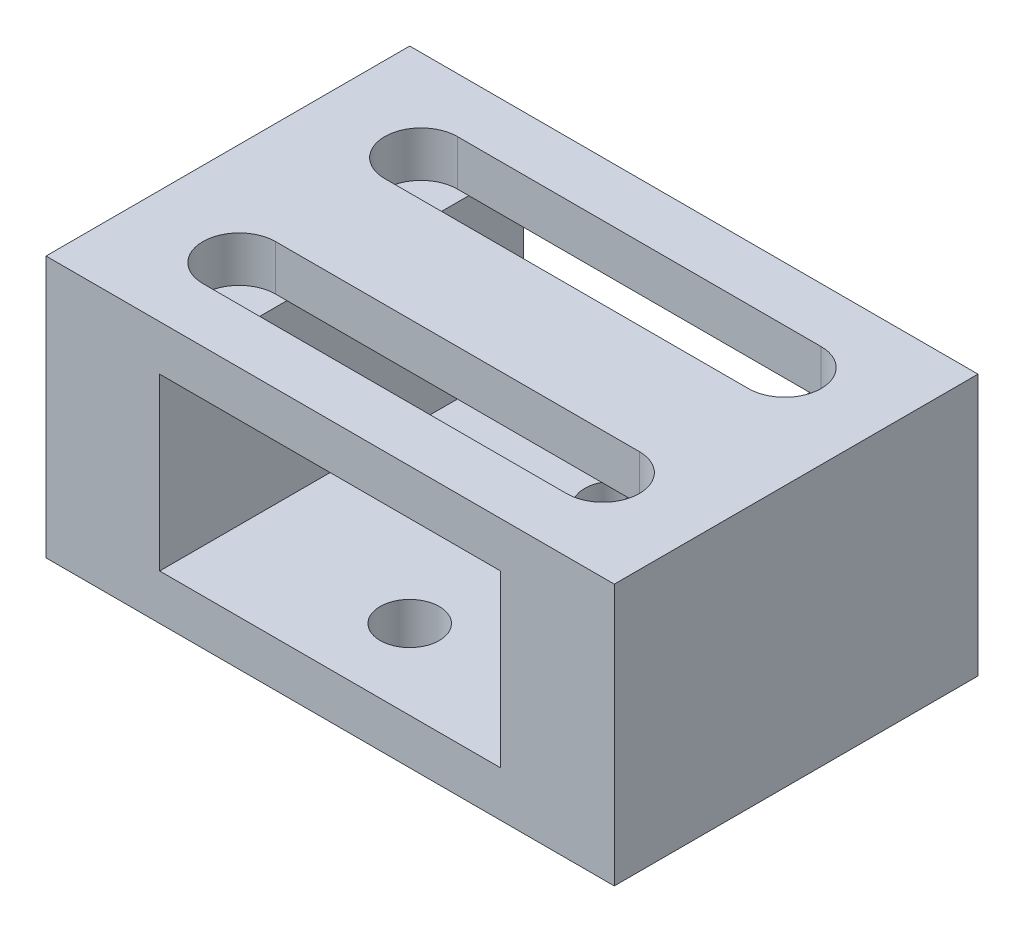
ISO-10303-21;
HEADER;
FILE_DESCRIPTION(('STEP AP214'),'2;1');
FILE_NAME('part.step','',(''),(''),'','','');
FILE_SCHEMA(('AUTOMOTIVE_DESIGN { 1 0 10303 214 1 1 1 1 }'));
ENDSEC;
DATA;
#1=APPLICATION_CONTEXT('core data for automotive mechanical design processes');
#2=APPLICATION_PROTOCOL_DEFINITION('international standard','automotive_design',2000,#1);
#3=PRODUCT_CONTEXT('',#1,'mechanical');
#4=PRODUCT('Part','Part','',(#3));
#5=PRODUCT_RELATED_PRODUCT_CATEGORY('part','',(#4));
#6=PRODUCT_DEFINITION_FORMATION('','',#4);
#7=PRODUCT_DEFINITION_CONTEXT('part definition',#1,'design');
#8=PRODUCT_DEFINITION('design','',#6,#7);
#9=PRODUCT_DEFINITION_SHAPE('','',#8);
#10=(LENGTH_UNIT() NAMED_UNIT(*) SI_UNIT(.MILLI.,.METRE.));
#11=(NAMED_UNIT(*) PLANE_ANGLE_UNIT() SI_UNIT($,.RADIAN.));
#12=(NAMED_UNIT(*) SI_UNIT($,.STERADIAN.) SOLID_ANGLE_UNIT());
#13=UNCERTAINTY_MEASURE_WITH_UNIT(LENGTH_MEASURE(1.E-05),#10,'distance_accuracy_value','');
#14=(GEOMETRIC_REPRESENTATION_CONTEXT(3) GLOBAL_UNCERTAINTY_ASSIGNED_CONTEXT((#13)) GLOBAL_UNIT_ASSIGNED_CONTEXT((#10,
#11,#12)) REPRESENTATION_CONTEXT('',''));
#15=CARTESIAN_POINT('',(0.,0.,0.));
#16=DIRECTION('',(0.,0.,1.));
#17=DIRECTION('',(1.,0.,0.));
#18=AXIS2_PLACEMENT_3D('',#15,#16,#17);
#19=CARTESIAN_POINT('',(-25.,28.,-36.25));
#20=DIRECTION('',(0.,1.,0.));
#21=DIRECTION('',(0.,0.,1.));
#22=AXIS2_PLACEMENT_3D('',#19,#20,#21);
#23=PLANE('',#22);
#24=DIRECTION('',(1.,0.,0.));
#25=VECTOR('',#24,1.);
#26=CARTESIAN_POINT('',(-16.,28.,-57.05));
#27=LINE('',#26,#25);
#28=CARTESIAN_POINT('',(-16.,28.,-57.05));
#29=VERTEX_POINT('',#28);
#30=CARTESIAN_POINT('',(16.,28.,-57.05));
#31=VERTEX_POINT('',#30);
#32=EDGE_CURVE('E170',#29,#31,#27,.T.);
#33=ORIENTED_EDGE('',*,*,#32,.F.);
#34=CARTESIAN_POINT('',(-16.,28.,-60.25));
#35=DIRECTION('',(0.,1.,0.));
#36=DIRECTION('',(0.,0.,1.));
#37=AXIS2_PLACEMENT_3D('',#34,#35,#36);
#38=CIRCLE('',#37,3.19999999999999);
#39=CARTESIAN_POINT('',(-16.,28.,-63.45));
#40=VERTEX_POINT('',#39);
#41=EDGE_CURVE('E172',#40,#29,#38,.T.);
#42=ORIENTED_EDGE('',*,*,#41,.F.);
#43=DIRECTION('',(-1.,0.,0.));
#44=VECTOR('',#43,1.);
#45=CARTESIAN_POINT('',(-16.,28.,-63.45));
#46=LINE('',#45,#44);
#47=CARTESIAN_POINT('',(16.,28.,-63.45));
#48=VERTEX_POINT('',#47);
#49=EDGE_CURVE('E161',#48,#40,#46,.T.);
#50=ORIENTED_EDGE('',*,*,#49,.F.);
#51=CARTESIAN_POINT('',(16.,28.,-60.25));
#52=DIRECTION('',(0.,1.,0.));
#53=DIRECTION('',(0.,0.,1.));
#54=AXIS2_PLACEMENT_3D('',#51,#52,#53);
#55=CIRCLE('',#54,3.19999999999998);
#56=EDGE_CURVE('E168',#31,#48,#55,.T.);
#57=ORIENTED_EDGE('',*,*,#56,.F.);
#58=EDGE_LOOP('',(#33,#42,#50,#57));
#59=FACE_BOUND('',#58,.T.);
#60=DIRECTION('',(1.,0.,0.));
#61=VECTOR('',#60,1.);
#62=CARTESIAN_POINT('',(-16.,28.,-41.05));
#63=LINE('',#62,#61);
#64=CARTESIAN_POINT('',(-16.,28.,-41.05));
#65=VERTEX_POINT('',#64);
#66=CARTESIAN_POINT('',(16.,28.,-41.05));
#67=VERTEX_POINT('',#66);
#68=EDGE_CURVE('E243',#65,#67,#63,.T.);
#69=ORIENTED_EDGE('',*,*,#68,.F.);
#70=CARTESIAN_POINT('',(-16.,28.,-44.25));
#71=DIRECTION('',(0.,1.,0.));
#72=DIRECTION('',(0.,0.,1.));
#73=AXIS2_PLACEMENT_3D('',#70,#71,#72);
#74=CIRCLE('',#73,3.2);
#75=CARTESIAN_POINT('',(-16.,28.,-47.45));
#76=VERTEX_POINT('',#75);
#77=EDGE_CURVE('E142',#76,#65,#74,.T.);
#78=ORIENTED_EDGE('',*,*,#77,.F.);
#79=DIRECTION('',(-1.,0.,0.));
#80=VECTOR('',#79,1.);
#81=CARTESIAN_POINT('',(-16.,28.,-47.45));
#82=LINE('',#81,#80);
#83=CARTESIAN_POINT('',(16.,28.,-47.45));
#84=VERTEX_POINT('',#83);
#85=EDGE_CURVE('E143',#84,#76,#82,.T.);
#86=ORIENTED_EDGE('',*,*,#85,.F.);
#87=CARTESIAN_POINT('',(16.,28.,-44.25));
#88=DIRECTION('',(0.,1.,0.));
#89=DIRECTION('',(0.,0.,1.));
#90=AXIS2_PLACEMENT_3D('',#87,#88,#89);
#91=CIRCLE('',#90,3.2);
#92=EDGE_CURVE('E148',#67,#84,#91,.T.);
#93=ORIENTED_EDGE('',*,*,#92,.F.);
#94=EDGE_LOOP('',(#69,#78,#86,#93));
#95=FACE_BOUND('',#94,.T.);
#96=DIRECTION('',(0.,0.,1.));
#97=VECTOR('',#96,1.);
#98=CARTESIAN_POINT('',(-25.,28.,0.));
#99=LINE('',#98,#97);
#100=CARTESIAN_POINT('',(-25.,28.,-68.25));
#101=VERTEX_POINT('',#100);
#102=CARTESIAN_POINT('',(-25.,28.,-36.25));
#103=VERTEX_POINT('',#102);
#104=EDGE_CURVE('E391',#101,#103,#99,.T.);
#105=ORIENTED_EDGE('',*,*,#104,.T.);
#106=DIRECTION('',(-1.,0.,0.));
#107=VECTOR('',#106,1.);
#108=CARTESIAN_POINT('',(25.,28.,-36.25));
#109=LINE('',#108,#107);
#110=CARTESIAN_POINT('',(25.,28.,-36.25));
#111=VERTEX_POINT('',#110);
#112=EDGE_CURVE('E397',#111,#103,#109,.T.);
#113=ORIENTED_EDGE('',*,*,#112,.F.);
#114=DIRECTION('',(0.,0.,1.));
#115=VECTOR('',#114,1.);
#116=CARTESIAN_POINT('',(25.,28.,0.));
#117=LINE('',#116,#115);
#118=CARTESIAN_POINT('',(25.,28.,-68.25));
#119=VERTEX_POINT('',#118);
#120=EDGE_CURVE('E396',#119,#111,#117,.T.);
#121=ORIENTED_EDGE('',*,*,#120,.F.);
#122=DIRECTION('',(-1.,0.,0.));
#123=VECTOR('',#122,1.);
#124=CARTESIAN_POINT('',(25.,28.,-68.25));
#125=LINE('',#124,#123);
#126=EDGE_CURVE('E407',#119,#101,#125,.T.);
#127=ORIENTED_EDGE('',*,*,#126,.T.);
#128=EDGE_LOOP('',(#105,#113,#121,#127));
#129=FACE_BOUND('',#128,.T.);
#130=ADVANCED_FACE('F40',(#59,#95,#129),#23,.T.);
#131=CARTESIAN_POINT('',(15.,9.00000000000002,110.001));
#132=DIRECTION('',(1.,0.,0.));
#133=DIRECTION('',(0.,0.,-1.));
#134=AXIS2_PLACEMENT_3D('',#131,#132,#133);
#135=PLANE('',#134);
#136=DIRECTION('',(0.,1.,0.));
#137=VECTOR('',#136,1.);
#138=CARTESIAN_POINT('',(15.,9.00000000000002,-36.25));
#139=LINE('',#138,#137);
#140=CARTESIAN_POINT('',(15.,9.00000000000002,-36.25));
#141=VERTEX_POINT('',#140);
#142=CARTESIAN_POINT('',(15.,24.,-36.25));
#143=VERTEX_POINT('',#142);
#144=EDGE_CURVE('E156',#141,#143,#139,.T.);
#145=ORIENTED_EDGE('',*,*,#144,.T.);
#146=DIRECTION('',(0.,0.,-1.));
#147=VECTOR('',#146,1.);
#148=CARTESIAN_POINT('',(15.,24.,110.001));
#149=LINE('',#148,#147);
#150=CARTESIAN_POINT('',(15.,24.,-41.05));
#151=VERTEX_POINT('',#150);
#152=EDGE_CURVE('E267',#143,#151,#149,.T.);
#153=ORIENTED_EDGE('',*,*,#152,.T.);
#154=CARTESIAN_POINT('',(15.,24.,-47.45));
#155=VERTEX_POINT('',#154);
#156=EDGE_CURVE('E261',#151,#155,#149,.T.);
#157=ORIENTED_EDGE('',*,*,#156,.T.);
#158=CARTESIAN_POINT('',(15.,24.,-57.05));
#159=VERTEX_POINT('',#158);
#160=EDGE_CURVE('E266',#155,#159,#149,.T.);
#161=ORIENTED_EDGE('',*,*,#160,.T.);
#162=CARTESIAN_POINT('',(15.,24.,-63.45));
#163=VERTEX_POINT('',#162);
#164=EDGE_CURVE('E279',#159,#163,#149,.T.);
#165=ORIENTED_EDGE('',*,*,#164,.T.);
#166=CARTESIAN_POINT('',(15.,24.,-68.25));
#167=VERTEX_POINT('',#166);
#168=EDGE_CURVE('E275',#163,#167,#149,.T.);
#169=ORIENTED_EDGE('',*,*,#168,.T.);
#170=DIRECTION('',(0.,-1.,0.));
#171=VECTOR('',#170,1.);
#172=CARTESIAN_POINT('',(15.,9.00000000000002,-68.25));
#173=LINE('',#172,#171);
#174=CARTESIAN_POINT('',(15.,9.00000000000002,-68.25));
#175=VERTEX_POINT('',#174);
#176=EDGE_CURVE('E372',#167,#175,#173,.T.);
#177=ORIENTED_EDGE('',*,*,#176,.T.);
#178=DIRECTION('',(0.,0.,-1.));
#179=VECTOR('',#178,1.);
#180=CARTESIAN_POINT('',(15.,9.00000000000002,110.001));
#181=LINE('',#180,#179);
#182=EDGE_CURVE('E213',#141,#175,#181,.T.);
#183=ORIENTED_EDGE('',*,*,#182,.F.);
#184=EDGE_LOOP('',(#145,#153,#157,#161,#165,#169,#177,#183));
#185=FACE_BOUND('',#184,.T.);
#186=ADVANCED_FACE('F274',(#185),#135,.F.);
#187=CARTESIAN_POINT('',(15.,24.,110.001));
#188=DIRECTION('',(0.,1.,0.));
#189=DIRECTION('',(0.,0.,1.));
#190=AXIS2_PLACEMENT_3D('',#187,#188,#189);
#191=PLANE('',#190);
#192=ORIENTED_EDGE('',*,*,#168,.F.);
#193=DIRECTION('',(1.,0.,0.));
#194=VECTOR('',#193,1.);
#195=CARTESIAN_POINT('',(-16.,24.,-63.45));
#196=LINE('',#195,#194);
#197=CARTESIAN_POINT('',(-15.,24.,-63.45));
#198=VERTEX_POINT('',#197);
#199=EDGE_CURVE('E180',#198,#163,#196,.T.);
#200=ORIENTED_EDGE('',*,*,#199,.F.);
#201=DIRECTION('',(0.,0.,-1.));
#202=VECTOR('',#201,1.);
#203=CARTESIAN_POINT('',(-15.,24.,110.001));
#204=LINE('',#203,#202);
#205=CARTESIAN_POINT('',(-15.,24.,-68.25));
#206=VERTEX_POINT('',#205);
#207=EDGE_CURVE('E285',#198,#206,#204,.T.);
#208=ORIENTED_EDGE('',*,*,#207,.T.);
#209=DIRECTION('',(1.,0.,0.));
#210=VECTOR('',#209,1.);
#211=CARTESIAN_POINT('',(15.,24.,-68.25));
#212=LINE('',#211,#210);
#213=EDGE_CURVE('E366',#206,#167,#212,.T.);
#214=ORIENTED_EDGE('',*,*,#213,.T.);
#215=EDGE_LOOP('',(#192,#200,#208,#214));
#216=FACE_BOUND('',#215,.T.);
#217=ADVANCED_FACE('F364',(#216),#191,.F.);
#218=CARTESIAN_POINT('',(-16.,-14.9296801939086,-63.45));
#219=DIRECTION('',(0.,0.,-1.));
#220=DIRECTION('',(-1.,0.,0.));
#221=AXIS2_PLACEMENT_3D('',#218,#219,#220);
#222=PLANE('',#221);
#223=CARTESIAN_POINT('',(-16.,24.,-63.45));
#224=VERTEX_POINT('',#223);
#225=EDGE_CURVE('E177',#224,#198,#196,.T.);
#226=ORIENTED_EDGE('',*,*,#225,.T.);
#227=ORIENTED_EDGE('',*,*,#199,.T.);
#228=CARTESIAN_POINT('',(16.,24.,-63.45));
#229=VERTEX_POINT('',#228);
#230=EDGE_CURVE('E181',#163,#229,#196,.T.);
#231=ORIENTED_EDGE('',*,*,#230,.T.);
#232=DIRECTION('',(0.,1.,0.));
#233=VECTOR('',#232,1.);
#234=CARTESIAN_POINT('',(16.,-14.9296801939086,-63.45));
#235=LINE('',#234,#233);
#236=EDGE_CURVE('E84',#229,#48,#235,.T.);
#237=ORIENTED_EDGE('',*,*,#236,.T.);
#238=ORIENTED_EDGE('',*,*,#49,.T.);
#239=DIRECTION('',(0.,1.,0.));
#240=VECTOR('',#239,1.);
#241=CARTESIAN_POINT('',(-16.,-14.9296801939086,-63.45));
#242=LINE('',#241,#240);
#243=EDGE_CURVE('E164',#224,#40,#242,.T.);
#244=ORIENTED_EDGE('',*,*,#243,.F.);
#245=EDGE_LOOP('',(#226,#227,#231,#237,#238,#244));
#246=FACE_BOUND('',#245,.T.);
#247=ADVANCED_FACE('F360',(#246),#222,.F.);
#248=CARTESIAN_POINT('',(16.,-14.9296801939086,-60.25));
#249=DIRECTION('',(0.,1.,0.));
#250=DIRECTION('',(0.,0.,1.));
#251=AXIS2_PLACEMENT_3D('',#248,#249,#250);
#252=CYLINDRICAL_SURFACE('',#251,3.19999999999998);
#253=CARTESIAN_POINT('',(16.,24.,-60.25));
#254=DIRECTION('',(0.,1.,0.));
#255=DIRECTION('',(0.,0.,1.));
#256=AXIS2_PLACEMENT_3D('',#253,#254,#255);
#257=CIRCLE('',#256,3.19999999999998);
#258=CARTESIAN_POINT('',(16.,24.,-57.05));
#259=VERTEX_POINT('',#258);
#260=EDGE_CURVE('E166',#229,#259,#257,.F.);
#261=ORIENTED_EDGE('',*,*,#260,.T.);
#262=DIRECTION('',(0.,1.,0.));
#263=VECTOR('',#262,1.);
#264=CARTESIAN_POINT('',(16.,-14.9296801939086,-57.05));
#265=LINE('',#264,#263);
#266=EDGE_CURVE('E90',#259,#31,#265,.T.);
#267=ORIENTED_EDGE('',*,*,#266,.T.);
#268=ORIENTED_EDGE('',*,*,#56,.T.);
#269=ORIENTED_EDGE('',*,*,#236,.F.);
#270=EDGE_LOOP('',(#261,#267,#268,#269));
#271=FACE_BOUND('',#270,.T.);
#272=ADVANCED_FACE('F353',(#271),#252,.F.);
#273=CARTESIAN_POINT('',(-16.,-14.9296801939086,-60.25));
#274=DIRECTION('',(0.,1.,0.));
#275=DIRECTION('',(0.,0.,1.));
#276=AXIS2_PLACEMENT_3D('',#273,#274,#275);
#277=CYLINDRICAL_SURFACE('',#276,3.19999999999999);
#278=CARTESIAN_POINT('',(-16.,24.,-60.25));
#279=DIRECTION('',(0.,1.,0.));
#280=DIRECTION('',(0.,0.,1.));
#281=AXIS2_PLACEMENT_3D('',#278,#279,#280);
#282=CIRCLE('',#281,3.19999999999999);
#283=CARTESIAN_POINT('',(-16.,24.,-57.05));
#284=VERTEX_POINT('',#283);
#285=EDGE_CURVE('E175',#284,#224,#282,.F.);
#286=ORIENTED_EDGE('',*,*,#285,.T.);
#287=ORIENTED_EDGE('',*,*,#243,.T.);
#288=ORIENTED_EDGE('',*,*,#41,.T.);
#289=DIRECTION('',(0.,1.,0.));
#290=VECTOR('',#289,1.);
#291=CARTESIAN_POINT('',(-16.,-14.9296801939086,-57.05));
#292=LINE('',#291,#290);
#293=EDGE_CURVE('E158',#284,#29,#292,.T.);
#294=ORIENTED_EDGE('',*,*,#293,.F.);
#295=EDGE_LOOP('',(#286,#287,#288,#294));
#296=FACE_BOUND('',#295,.T.);
#297=ADVANCED_FACE('F344',(#296),#277,.F.);
#298=CARTESIAN_POINT('',(15.,24.,110.001));
#299=DIRECTION('',(0.,1.,0.));
#300=DIRECTION('',(0.,0.,1.));
#301=AXIS2_PLACEMENT_3D('',#298,#299,#300);
#302=PLANE('',#301);
#303=CARTESIAN_POINT('',(-15.,24.,-57.05));
#304=VERTEX_POINT('',#303);
#305=EDGE_CURVE('E693',#304,#198,#204,.T.);
#306=ORIENTED_EDGE('',*,*,#305,.T.);
#307=ORIENTED_EDGE('',*,*,#225,.F.);
#308=ORIENTED_EDGE('',*,*,#285,.F.);
#309=DIRECTION('',(-1.,0.,0.));
#310=VECTOR('',#309,1.);
#311=CARTESIAN_POINT('',(-16.,24.,-57.05));
#312=LINE('',#311,#310);
#313=EDGE_CURVE('E157',#304,#284,#312,.T.);
#314=ORIENTED_EDGE('',*,*,#313,.F.);
#315=EDGE_LOOP('',(#306,#307,#308,#314));
#316=FACE_BOUND('',#315,.T.);
#317=ADVANCED_FACE('F460',(#316),#302,.T.);
#318=CARTESIAN_POINT('',(-15.,24.,-47.45));
#319=VERTEX_POINT('',#318);
#320=EDGE_CURVE('E694',#319,#304,#204,.T.);
#321=ORIENTED_EDGE('',*,*,#320,.T.);
#322=EDGE_CURVE('E155',#159,#304,#312,.T.);
#323=ORIENTED_EDGE('',*,*,#322,.F.);
#324=ORIENTED_EDGE('',*,*,#160,.F.);
#325=DIRECTION('',(1.,0.,0.));
#326=VECTOR('',#325,1.);
#327=CARTESIAN_POINT('',(-16.,24.,-47.45));
#328=LINE('',#327,#326);
#329=EDGE_CURVE('E240',#319,#155,#328,.T.);
#330=ORIENTED_EDGE('',*,*,#329,.F.);
#331=EDGE_LOOP('',(#321,#323,#324,#330));
#332=FACE_BOUND('',#331,.T.);
#333=ADVANCED_FACE('F294',(#332),#191,.F.);
#334=ORIENTED_EDGE('',*,*,#164,.F.);
#335=EDGE_CURVE('E152',#259,#159,#312,.T.);
#336=ORIENTED_EDGE('',*,*,#335,.F.);
#337=ORIENTED_EDGE('',*,*,#260,.F.);
#338=ORIENTED_EDGE('',*,*,#230,.F.);
#339=EDGE_LOOP('',(#334,#336,#337,#338));
#340=FACE_BOUND('',#339,.T.);
#341=ADVANCED_FACE('F357',(#340),#302,.T.);
#342=CARTESIAN_POINT('',(-16.,-14.9296801939086,-57.05));
#343=DIRECTION('',(0.,0.,1.));
#344=DIRECTION('',(1.,0.,0.));
#345=AXIS2_PLACEMENT_3D('',#342,#343,#344);
#346=PLANE('',#345);
#347=ORIENTED_EDGE('',*,*,#335,.T.);
#348=ORIENTED_EDGE('',*,*,#322,.T.);
#349=ORIENTED_EDGE('',*,*,#313,.T.);
#350=ORIENTED_EDGE('',*,*,#293,.T.);
#351=ORIENTED_EDGE('',*,*,#32,.T.);
#352=ORIENTED_EDGE('',*,*,#266,.F.);
#353=EDGE_LOOP('',(#347,#348,#349,#350,#351,#352));
#354=FACE_BOUND('',#353,.T.);
#355=ADVANCED_FACE('F350',(#354),#346,.F.);
#356=CARTESIAN_POINT('',(-16.,-14.9296801939086,-47.45));
#357=DIRECTION('',(0.,0.,-1.));
#358=DIRECTION('',(-1.,0.,0.));
#359=AXIS2_PLACEMENT_3D('',#356,#357,#358);
#360=PLANE('',#359);
#361=CARTESIAN_POINT('',(-16.,24.,-47.45));
#362=VERTEX_POINT('',#361);
#363=EDGE_CURVE('E135',#362,#319,#328,.T.);
#364=ORIENTED_EDGE('',*,*,#363,.T.);
#365=ORIENTED_EDGE('',*,*,#329,.T.);
#366=CARTESIAN_POINT('',(16.,24.,-47.45));
#367=VERTEX_POINT('',#366);
#368=EDGE_CURVE('E56',#155,#367,#328,.T.);
#369=ORIENTED_EDGE('',*,*,#368,.T.);
#370=DIRECTION('',(0.,1.,0.));
#371=VECTOR('',#370,1.);
#372=CARTESIAN_POINT('',(16.,-14.9296801939086,-47.45));
#373=LINE('',#372,#371);
#374=EDGE_CURVE('E145',#367,#84,#373,.T.);
#375=ORIENTED_EDGE('',*,*,#374,.T.);
#376=ORIENTED_EDGE('',*,*,#85,.T.);
#377=DIRECTION('',(0.,1.,0.));
#378=VECTOR('',#377,1.);
#379=CARTESIAN_POINT('',(-16.,-14.9296801939086,-47.45));
#380=LINE('',#379,#378);
#381=EDGE_CURVE('E239',#362,#76,#380,.T.);
#382=ORIENTED_EDGE('',*,*,#381,.F.);
#383=EDGE_LOOP('',(#364,#365,#369,#375,#376,#382));
#384=FACE_BOUND('',#383,.T.);
#385=ADVANCED_FACE('F246',(#384),#360,.F.);
#386=CARTESIAN_POINT('',(16.,-14.9296801939086,-44.25));
#387=DIRECTION('',(0.,1.,0.));
#388=DIRECTION('',(0.,0.,1.));
#389=AXIS2_PLACEMENT_3D('',#386,#387,#388);
#390=CYLINDRICAL_SURFACE('',#389,3.2);
#391=CARTESIAN_POINT('',(16.,24.,-44.25));
#392=DIRECTION('',(0.,1.,0.));
#393=DIRECTION('',(0.,0.,1.));
#394=AXIS2_PLACEMENT_3D('',#391,#392,#393);
#395=CIRCLE('',#394,3.2);
#396=CARTESIAN_POINT('',(16.,24.,-41.05));
#397=VERTEX_POINT('',#396);
#398=EDGE_CURVE('E109',#367,#397,#395,.F.);
#399=ORIENTED_EDGE('',*,*,#398,.T.);
#400=DIRECTION('',(0.,1.,0.));
#401=VECTOR('',#400,1.);
#402=CARTESIAN_POINT('',(16.,-14.9296801939086,-41.05));
#403=LINE('',#402,#401);
#404=EDGE_CURVE('E99',#397,#67,#403,.T.);
#405=ORIENTED_EDGE('',*,*,#404,.T.);
#406=ORIENTED_EDGE('',*,*,#92,.T.);
#407=ORIENTED_EDGE('',*,*,#374,.F.);
#408=EDGE_LOOP('',(#399,#405,#406,#407));
#409=FACE_BOUND('',#408,.T.);
#410=ADVANCED_FACE('F249',(#409),#390,.F.);
#411=CARTESIAN_POINT('',(-16.,-14.9296801939086,-44.25));
#412=DIRECTION('',(0.,1.,0.));
#413=DIRECTION('',(0.,0.,1.));
#414=AXIS2_PLACEMENT_3D('',#411,#412,#413);
#415=CYLINDRICAL_SURFACE('',#414,3.2);
#416=CARTESIAN_POINT('',(-16.,24.,-44.25));
#417=DIRECTION('',(0.,1.,0.));
#418=DIRECTION('',(0.,0.,1.));
#419=AXIS2_PLACEMENT_3D('',#416,#417,#418);
#420=CIRCLE('',#419,3.2);
#421=CARTESIAN_POINT('',(-16.,24.,-41.05));
#422=VERTEX_POINT('',#421);
#423=EDGE_CURVE('E132',#422,#362,#420,.F.);
#424=ORIENTED_EDGE('',*,*,#423,.T.);
#425=ORIENTED_EDGE('',*,*,#381,.T.);
#426=ORIENTED_EDGE('',*,*,#77,.T.);
#427=DIRECTION('',(0.,1.,0.));
#428=VECTOR('',#427,1.);
#429=CARTESIAN_POINT('',(-16.,-14.9296801939086,-41.05));
#430=LINE('',#429,#428);
#431=EDGE_CURVE('E121',#422,#65,#430,.T.);
#432=ORIENTED_EDGE('',*,*,#431,.F.);
#433=EDGE_LOOP('',(#424,#425,#426,#432));
#434=FACE_BOUND('',#433,.T.);
#435=ADVANCED_FACE('F140',(#434),#415,.F.);
#436=CARTESIAN_POINT('',(15.,24.,110.001));
#437=DIRECTION('',(0.,1.,0.));
#438=DIRECTION('',(0.,0.,1.));
#439=AXIS2_PLACEMENT_3D('',#436,#437,#438);
#440=PLANE('',#439);
#441=CARTESIAN_POINT('',(-15.,24.,-41.05));
#442=VERTEX_POINT('',#441);
#443=EDGE_CURVE('E284',#442,#319,#204,.T.);
#444=ORIENTED_EDGE('',*,*,#443,.T.);
#445=ORIENTED_EDGE('',*,*,#363,.F.);
#446=ORIENTED_EDGE('',*,*,#423,.F.);
#447=DIRECTION('',(-1.,0.,0.));
#448=VECTOR('',#447,1.);
#449=CARTESIAN_POINT('',(-16.,24.,-41.05));
#450=LINE('',#449,#448);
#451=EDGE_CURVE('E115',#442,#422,#450,.T.);
#452=ORIENTED_EDGE('',*,*,#451,.F.);
#453=EDGE_LOOP('',(#444,#445,#446,#452));
#454=FACE_BOUND('',#453,.T.);
#455=ADVANCED_FACE('F133',(#454),#440,.T.);
#456=CARTESIAN_POINT('',(-15.,24.,-36.25));
#457=VERTEX_POINT('',#456);
#458=EDGE_CURVE('E273',#457,#442,#204,.T.);
#459=ORIENTED_EDGE('',*,*,#458,.T.);
#460=EDGE_CURVE('E124',#151,#442,#450,.T.);
#461=ORIENTED_EDGE('',*,*,#460,.F.);
#462=ORIENTED_EDGE('',*,*,#152,.F.);
#463=DIRECTION('',(-1.,0.,0.));
#464=VECTOR('',#463,1.);
#465=CARTESIAN_POINT('',(15.,24.,-36.25));
#466=LINE('',#465,#464);
#467=EDGE_CURVE('E231',#143,#457,#466,.T.);
#468=ORIENTED_EDGE('',*,*,#467,.T.);
#469=EDGE_LOOP('',(#459,#461,#462,#468));
#470=FACE_BOUND('',#469,.T.);
#471=ADVANCED_FACE('F271',(#470),#191,.F.);
#472=ORIENTED_EDGE('',*,*,#156,.F.);
#473=EDGE_CURVE('E130',#397,#151,#450,.T.);
#474=ORIENTED_EDGE('',*,*,#473,.F.);
#475=ORIENTED_EDGE('',*,*,#398,.F.);
#476=ORIENTED_EDGE('',*,*,#368,.F.);
#477=EDGE_LOOP('',(#472,#474,#475,#476));
#478=FACE_BOUND('',#477,.T.);
#479=ADVANCED_FACE('F259',(#478),#440,.T.);
#480=CARTESIAN_POINT('',(-16.,-14.9296801939086,-41.05));
#481=DIRECTION('',(0.,0.,1.));
#482=DIRECTION('',(1.,0.,0.));
#483=AXIS2_PLACEMENT_3D('',#480,#481,#482);
#484=PLANE('',#483);
#485=ORIENTED_EDGE('',*,*,#473,.T.);
#486=ORIENTED_EDGE('',*,*,#460,.T.);
#487=ORIENTED_EDGE('',*,*,#451,.T.);
#488=ORIENTED_EDGE('',*,*,#431,.T.);
#489=ORIENTED_EDGE('',*,*,#68,.T.);
#490=ORIENTED_EDGE('',*,*,#404,.F.);
#491=EDGE_LOOP('',(#485,#486,#487,#488,#489,#490));
#492=FACE_BOUND('',#491,.T.);
#493=ADVANCED_FACE('F118',(#492),#484,.F.);
#494=CARTESIAN_POINT('',(-15.,9.00000000000002,110.001));
#495=DIRECTION('',(-1.,0.,0.));
#496=DIRECTION('',(0.,0.,1.));
#497=AXIS2_PLACEMENT_3D('',#494,#495,#496);
#498=PLANE('',#497);
#499=DIRECTION('',(0.,-1.,0.));
#500=VECTOR('',#499,1.);
#501=CARTESIAN_POINT('',(-15.,9.00000000000002,-36.25));
#502=LINE('',#501,#500);
#503=CARTESIAN_POINT('',(-15.,9.00000000000002,-36.25));
#504=VERTEX_POINT('',#503);
#505=EDGE_CURVE('E223',#457,#504,#502,.T.);
#506=ORIENTED_EDGE('',*,*,#505,.T.);
#507=DIRECTION('',(0.,0.,-1.));
#508=VECTOR('',#507,1.);
#509=CARTESIAN_POINT('',(-15.,9.00000000000002,110.001));
#510=LINE('',#509,#508);
#511=CARTESIAN_POINT('',(-15.,9.00000000000002,-68.25));
#512=VERTEX_POINT('',#511);
#513=EDGE_CURVE('E217',#504,#512,#510,.T.);
#514=ORIENTED_EDGE('',*,*,#513,.T.);
#515=DIRECTION('',(0.,1.,0.));
#516=VECTOR('',#515,1.);
#517=CARTESIAN_POINT('',(-15.,9.00000000000002,-68.25));
#518=LINE('',#517,#516);
#519=EDGE_CURVE('E371',#512,#206,#518,.T.);
#520=ORIENTED_EDGE('',*,*,#519,.T.);
#521=ORIENTED_EDGE('',*,*,#207,.F.);
#522=ORIENTED_EDGE('',*,*,#305,.F.);
#523=ORIENTED_EDGE('',*,*,#320,.F.);
#524=ORIENTED_EDGE('',*,*,#443,.F.);
#525=ORIENTED_EDGE('',*,*,#458,.F.);
#526=EDGE_LOOP('',(#506,#514,#520,#521,#522,#523,#524,#525));
#527=FACE_BOUND('',#526,.T.);
#528=ADVANCED_FACE('F199',(#527),#498,.F.);
#529=CARTESIAN_POINT('',(15.,9.00000000000002,110.001));
#530=DIRECTION('',(0.,-1.,0.));
#531=DIRECTION('',(0.,0.,-1.));
#532=AXIS2_PLACEMENT_3D('',#529,#530,#531);
#533=PLANE('',#532);
#534=CARTESIAN_POINT('',(0.,9.00000000000002,-61.25));
#535=DIRECTION('',(0.,1.,0.));
#536=DIRECTION('',(0.,0.,1.));
#537=AXIS2_PLACEMENT_3D('',#534,#535,#536);
#538=CIRCLE('',#537,2.6);
#539=CARTESIAN_POINT('',(0.,9.00000000000002,-58.65));
#540=VERTEX_POINT('',#539);
#541=EDGE_CURVE('E43',#540,#540,#538,.T.);
#542=ORIENTED_EDGE('',*,*,#541,.F.);
#543=EDGE_LOOP('',(#542));
#544=FACE_BOUND('',#543,.T.);
#545=CARTESIAN_POINT('',(0.,9.00000000000002,-43.25));
#546=DIRECTION('',(0.,1.,0.));
#547=DIRECTION('',(0.,0.,1.));
#548=AXIS2_PLACEMENT_3D('',#545,#546,#547);
#549=CIRCLE('',#548,2.6);
#550=CARTESIAN_POINT('',(0.,9.00000000000002,-40.65));
#551=VERTEX_POINT('',#550);
#552=EDGE_CURVE('E11',#551,#551,#549,.T.);
#553=ORIENTED_EDGE('',*,*,#552,.F.);
#554=EDGE_LOOP('',(#553));
#555=FACE_BOUND('',#554,.T.);
#556=DIRECTION('',(1.,0.,0.));
#557=VECTOR('',#556,1.);
#558=CARTESIAN_POINT('',(15.,9.00000000000002,-36.25));
#559=LINE('',#558,#557);
#560=EDGE_CURVE('E208',#504,#141,#559,.T.);
#561=ORIENTED_EDGE('',*,*,#560,.T.);
#562=ORIENTED_EDGE('',*,*,#182,.T.);
#563=DIRECTION('',(-1.,0.,0.));
#564=VECTOR('',#563,1.);
#565=CARTESIAN_POINT('',(15.,9.00000000000002,-68.25));
#566=LINE('',#565,#564);
#567=EDGE_CURVE('E376',#175,#512,#566,.T.);
#568=ORIENTED_EDGE('',*,*,#567,.T.);
#569=ORIENTED_EDGE('',*,*,#513,.F.);
#570=EDGE_LOOP('',(#561,#562,#568,#569));
#571=FACE_BOUND('',#570,.T.);
#572=ADVANCED_FACE('F195',(#544,#555,#571),#533,.F.);
#573=CARTESIAN_POINT('',(25.,0.,-68.25));
#574=DIRECTION('',(0.,0.,1.));
#575=DIRECTION('',(1.,0.,0.));
#576=AXIS2_PLACEMENT_3D('',#573,#574,#575);
#577=PLANE('',#576);
#578=ORIENTED_EDGE('',*,*,#213,.F.);
#579=ORIENTED_EDGE('',*,*,#519,.F.);
#580=ORIENTED_EDGE('',*,*,#567,.F.);
#581=ORIENTED_EDGE('',*,*,#176,.F.);
#582=EDGE_LOOP('',(#578,#579,#580,#581));
#583=FACE_BOUND('',#582,.T.);
#584=DIRECTION('',(0.,1.,0.));
#585=VECTOR('',#584,1.);
#586=CARTESIAN_POINT('',(-25.,0.,-68.25));
#587=LINE('',#586,#585);
#588=CARTESIAN_POINT('',(-25.,5.00000000000003,-68.25));
#589=VERTEX_POINT('',#588);
#590=EDGE_CURVE('E385',#589,#101,#587,.T.);
#591=ORIENTED_EDGE('',*,*,#590,.T.);
#592=ORIENTED_EDGE('',*,*,#126,.F.);
#593=DIRECTION('',(0.,1.,0.));
#594=VECTOR('',#593,1.);
#595=CARTESIAN_POINT('',(25.,0.,-68.25));
#596=LINE('',#595,#594);
#597=CARTESIAN_POINT('',(25.,5.00000000000003,-68.25));
#598=VERTEX_POINT('',#597);
#599=EDGE_CURVE('E394',#598,#119,#596,.T.);
#600=ORIENTED_EDGE('',*,*,#599,.F.);
#601=DIRECTION('',(-1.,0.,0.));
#602=VECTOR('',#601,1.);
#603=CARTESIAN_POINT('',(25.,5.00000000000003,-68.25));
#604=LINE('',#603,#602);
#605=EDGE_CURVE('E410',#598,#589,#604,.T.);
#606=ORIENTED_EDGE('',*,*,#605,.T.);
#607=EDGE_LOOP('',(#591,#592,#600,#606));
#608=FACE_BOUND('',#607,.T.);
#609=ADVANCED_FACE('F198',(#583,#608),#577,.F.);
#610=CARTESIAN_POINT('',(25.,0.,-36.25));
#611=DIRECTION('',(0.,0.,-1.));
#612=DIRECTION('',(-1.,0.,0.));
#613=AXIS2_PLACEMENT_3D('',#610,#611,#612);
#614=PLANE('',#613);
#615=ORIENTED_EDGE('',*,*,#560,.F.);
#616=ORIENTED_EDGE('',*,*,#505,.F.);
#617=ORIENTED_EDGE('',*,*,#467,.F.);
#618=ORIENTED_EDGE('',*,*,#144,.F.);
#619=EDGE_LOOP('',(#615,#616,#617,#618));
#620=FACE_BOUND('',#619,.T.);
#621=DIRECTION('',(0.,-1.,0.));
#622=VECTOR('',#621,1.);
#623=CARTESIAN_POINT('',(-25.,0.,-36.25));
#624=LINE('',#623,#622);
#625=CARTESIAN_POINT('',(-25.,5.00000000000003,-36.25));
#626=VERTEX_POINT('',#625);
#627=EDGE_CURVE('E382',#103,#626,#624,.T.);
#628=ORIENTED_EDGE('',*,*,#627,.T.);
#629=DIRECTION('',(-1.,0.,0.));
#630=VECTOR('',#629,1.);
#631=CARTESIAN_POINT('',(25.,5.00000000000003,-36.25));
#632=LINE('',#631,#630);
#633=CARTESIAN_POINT('',(25.,5.00000000000003,-36.25));
#634=VERTEX_POINT('',#633);
#635=EDGE_CURVE('E402',#634,#626,#632,.T.);
#636=ORIENTED_EDGE('',*,*,#635,.F.);
#637=DIRECTION('',(0.,-1.,0.));
#638=VECTOR('',#637,1.);
#639=CARTESIAN_POINT('',(25.,0.,-36.25));
#640=LINE('',#639,#638);
#641=EDGE_CURVE('E388',#111,#634,#640,.T.);
#642=ORIENTED_EDGE('',*,*,#641,.F.);
#643=ORIENTED_EDGE('',*,*,#112,.T.);
#644=EDGE_LOOP('',(#628,#636,#642,#643));
#645=FACE_BOUND('',#644,.T.);
#646=ADVANCED_FACE('F227',(#620,#645),#614,.F.);
#647=CARTESIAN_POINT('',(25.,0.,0.));
#648=DIRECTION('',(1.,0.,0.));
#649=DIRECTION('',(0.,0.,-1.));
#650=AXIS2_PLACEMENT_3D('',#647,#648,#649);
#651=PLANE('',#650);
#652=ORIENTED_EDGE('',*,*,#641,.T.);
#653=DIRECTION('',(0.,0.,-1.));
#654=VECTOR('',#653,1.);
#655=CARTESIAN_POINT('',(25.,5.00000000000002,0.));
#656=LINE('',#655,#654);
#657=EDGE_CURVE('E392',#634,#598,#656,.T.);
#658=ORIENTED_EDGE('',*,*,#657,.T.);
#659=ORIENTED_EDGE('',*,*,#599,.T.);
#660=ORIENTED_EDGE('',*,*,#120,.T.);
#661=EDGE_LOOP('',(#652,#658,#659,#660));
#662=FACE_BOUND('',#661,.T.);
#663=ADVANCED_FACE('F428',(#662),#651,.T.);
#664=CARTESIAN_POINT('',(-25.,0.,0.));
#665=DIRECTION('',(1.,0.,0.));
#666=DIRECTION('',(0.,0.,-1.));
#667=AXIS2_PLACEMENT_3D('',#664,#665,#666);
#668=PLANE('',#667);
#669=ORIENTED_EDGE('',*,*,#627,.F.);
#670=ORIENTED_EDGE('',*,*,#104,.F.);
#671=ORIENTED_EDGE('',*,*,#590,.F.);
#672=DIRECTION('',(0.,0.,-1.));
#673=VECTOR('',#672,1.);
#674=CARTESIAN_POINT('',(-25.,5.00000000000002,0.));
#675=LINE('',#674,#673);
#676=EDGE_CURVE('E399',#626,#589,#675,.T.);
#677=ORIENTED_EDGE('',*,*,#676,.F.);
#678=EDGE_LOOP('',(#669,#670,#671,#677));
#679=FACE_BOUND('',#678,.T.);
#680=ADVANCED_FACE('F423',(#679),#668,.F.);
#681=CARTESIAN_POINT('',(0.,-7.35391052434009,-43.25));
#682=DIRECTION('',(0.,1.,0.));
#683=DIRECTION('',(0.,0.,1.));
#684=AXIS2_PLACEMENT_3D('',#681,#682,#683);
#685=CYLINDRICAL_SURFACE('',#684,2.6);
#686=ORIENTED_EDGE('',*,*,#552,.T.);
#687=EDGE_LOOP('',(#686));
#688=FACE_BOUND('',#687,.T.);
#689=CARTESIAN_POINT('',(0.,5.,-43.25));
#690=DIRECTION('',(0.,1.,0.));
#691=DIRECTION('',(0.,0.,1.));
#692=AXIS2_PLACEMENT_3D('',#689,#690,#691);
#693=CIRCLE('',#692,2.6);
#694=CARTESIAN_POINT('',(0.,5.,-40.65));
#695=VERTEX_POINT('',#694);
#696=EDGE_CURVE('E185',#695,#695,#693,.T.);
#697=ORIENTED_EDGE('',*,*,#696,.F.);
#698=EDGE_LOOP('',(#697));
#699=FACE_BOUND('',#698,.T.);
#700=ADVANCED_FACE('F435',(#688,#699),#685,.F.);
#701=CARTESIAN_POINT('',(0.,-7.35391052434009,-61.25));
#702=DIRECTION('',(0.,1.,0.));
#703=DIRECTION('',(0.,0.,1.));
#704=AXIS2_PLACEMENT_3D('',#701,#702,#703);
#705=CYLINDRICAL_SURFACE('',#704,2.6);
#706=ORIENTED_EDGE('',*,*,#541,.T.);
#707=EDGE_LOOP('',(#706));
#708=FACE_BOUND('',#707,.T.);
#709=CARTESIAN_POINT('',(0.,5.,-61.25));
#710=DIRECTION('',(0.,1.,0.));
#711=DIRECTION('',(0.,0.,1.));
#712=AXIS2_PLACEMENT_3D('',#709,#710,#711);
#713=CIRCLE('',#712,2.6);
#714=CARTESIAN_POINT('',(0.,5.,-58.65));
#715=VERTEX_POINT('',#714);
#716=EDGE_CURVE('E128',#715,#715,#713,.T.);
#717=ORIENTED_EDGE('',*,*,#716,.F.);
#718=EDGE_LOOP('',(#717));
#719=FACE_BOUND('',#718,.T.);
#720=ADVANCED_FACE('F192',(#708,#719),#705,.F.);
#721=CARTESIAN_POINT('',(50.,5.,-110.));
#722=DIRECTION('',(0.,1.,0.));
#723=DIRECTION('',(0.,0.,1.));
#724=AXIS2_PLACEMENT_3D('',#721,#722,#723);
#725=PLANE('',#724);
#726=ORIENTED_EDGE('',*,*,#716,.T.);
#727=EDGE_LOOP('',(#726));
#728=FACE_BOUND('',#727,.T.);
#729=ORIENTED_EDGE('',*,*,#696,.T.);
#730=EDGE_LOOP('',(#729));
#731=FACE_BOUND('',#730,.T.);
#732=ORIENTED_EDGE('',*,*,#635,.T.);
#733=ORIENTED_EDGE('',*,*,#676,.T.);
#734=ORIENTED_EDGE('',*,*,#605,.F.);
#735=ORIENTED_EDGE('',*,*,#657,.F.);
#736=EDGE_LOOP('',(#732,#733,#734,#735));
#737=FACE_BOUND('',#736,.T.);
#738=ADVANCED_FACE('F415',(#728,#731,#737),#725,.F.);
#739=CLOSED_SHELL('',(#130,#186,#217,#247,#272,#297,#317,#333,#341,#355,#385,#410,#435,#455,
#471,#479,#493,#528,#572,#609,#646,#663,#680,#700,#720,#738));
#740=MANIFOLD_SOLID_BREP('B2',#739);
#741=ADVANCED_BREP_SHAPE_REPRESENTATION('',(#18,#740),#14);
#742=SHAPE_DEFINITION_REPRESENTATION(#9,#741);
ENDSEC;
END-ISO-10303-21;
